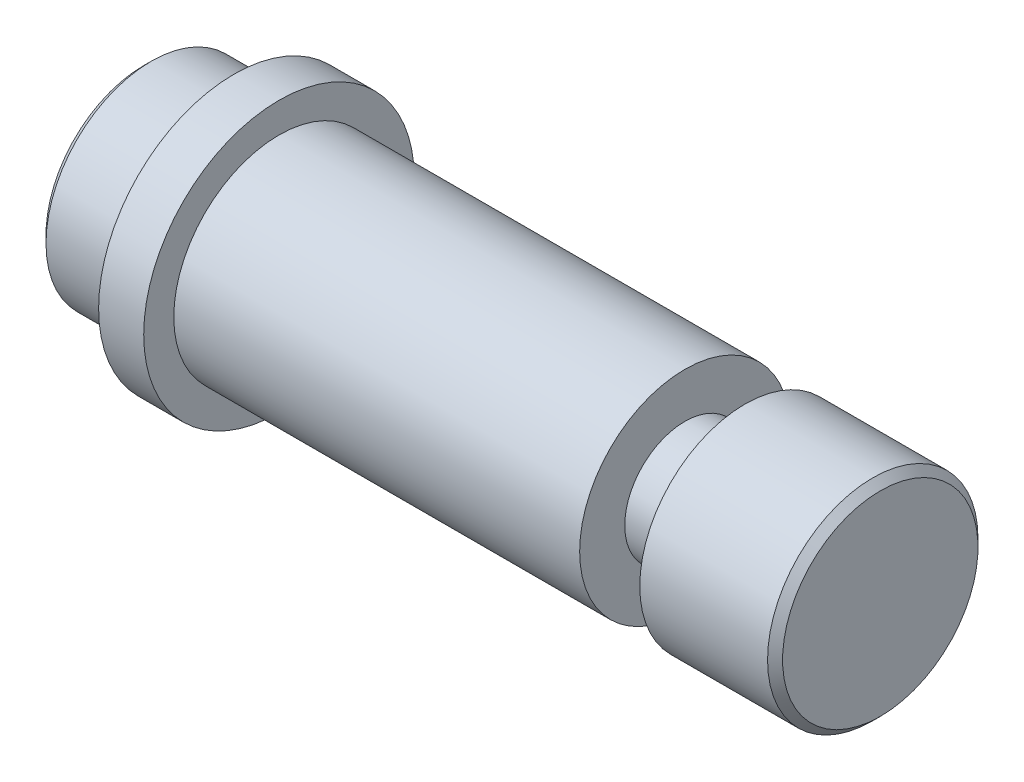
ISO-10303-21;
HEADER;
FILE_DESCRIPTION(('STEP AP214'),'2;1');
FILE_NAME('part.step','',(''),(''),'','','');
FILE_SCHEMA(('AUTOMOTIVE_DESIGN { 1 0 10303 214 1 1 1 1 }'));
ENDSEC;
DATA;
#1=APPLICATION_CONTEXT('core data for automotive mechanical design processes');
#2=APPLICATION_PROTOCOL_DEFINITION('international standard','automotive_design',2000,#1);
#3=PRODUCT_CONTEXT('',#1,'mechanical');
#4=PRODUCT('Part','Part','',(#3));
#5=PRODUCT_RELATED_PRODUCT_CATEGORY('part','',(#4));
#6=PRODUCT_DEFINITION_FORMATION('','',#4);
#7=PRODUCT_DEFINITION_CONTEXT('part definition',#1,'design');
#8=PRODUCT_DEFINITION('design','',#6,#7);
#9=PRODUCT_DEFINITION_SHAPE('','',#8);
#10=(LENGTH_UNIT() NAMED_UNIT(*) SI_UNIT(.MILLI.,.METRE.));
#11=(NAMED_UNIT(*) PLANE_ANGLE_UNIT() SI_UNIT($,.RADIAN.));
#12=(NAMED_UNIT(*) SI_UNIT($,.STERADIAN.) SOLID_ANGLE_UNIT());
#13=UNCERTAINTY_MEASURE_WITH_UNIT(LENGTH_MEASURE(1.E-05),#10,'distance_accuracy_value','');
#14=(GEOMETRIC_REPRESENTATION_CONTEXT(3) GLOBAL_UNCERTAINTY_ASSIGNED_CONTEXT((#13)) GLOBAL_UNIT_ASSIGNED_CONTEXT((#10,
#11,#12)) REPRESENTATION_CONTEXT('',''));
#15=CARTESIAN_POINT('',(0.,0.,0.));
#16=DIRECTION('',(0.,0.,1.));
#17=DIRECTION('',(1.,0.,0.));
#18=AXIS2_PLACEMENT_3D('',#15,#16,#17);
#19=CARTESIAN_POINT('',(-18.3988269794721,0.,0.));
#20=DIRECTION('',(-1.,0.,0.));
#21=DIRECTION('',(0.,-1.,0.));
#22=AXIS2_PLACEMENT_3D('',#19,#20,#21);
#23=PLANE('',#22);
#24=CARTESIAN_POINT('',(-18.3988269794721,0.,0.));
#25=DIRECTION('',(-1.,0.,0.));
#26=DIRECTION('',(0.,-1.,0.));
#27=AXIS2_PLACEMENT_3D('',#24,#25,#26);
#28=CIRCLE('',#27,6.5);
#29=CARTESIAN_POINT('',(-18.3988269794721,-6.5,0.));
#30=VERTEX_POINT('',#29);
#31=EDGE_CURVE('E10',#30,#30,#28,.T.);
#32=ORIENTED_EDGE('',*,*,#31,.T.);
#33=EDGE_LOOP('',(#32));
#34=FACE_BOUND('',#33,.T.);
#35=ADVANCED_FACE('F33',(#34),#23,.T.);
#36=CARTESIAN_POINT('',(30.6011730205279,0.,0.));
#37=DIRECTION('',(1.,0.,0.));
#38=DIRECTION('',(0.,1.,0.));
#39=AXIS2_PLACEMENT_3D('',#36,#37,#38);
#40=CYLINDRICAL_SURFACE('',#39,7.);
#41=CARTESIAN_POINT('',(-17.8988269794721,0.,0.));
#42=DIRECTION('',(-1.,0.,0.));
#43=DIRECTION('',(0.,-1.,0.));
#44=AXIS2_PLACEMENT_3D('',#41,#42,#43);
#45=CIRCLE('',#44,7.);
#46=CARTESIAN_POINT('',(-17.8988269794721,-7.,0.));
#47=VERTEX_POINT('',#46);
#48=EDGE_CURVE('E41',#47,#47,#45,.F.);
#49=ORIENTED_EDGE('',*,*,#48,.T.);
#50=EDGE_LOOP('',(#49));
#51=FACE_BOUND('',#50,.T.);
#52=CARTESIAN_POINT('',(-12.3988269794721,0.,0.));
#53=DIRECTION('',(1.,0.,0.));
#54=DIRECTION('',(0.,1.,0.));
#55=AXIS2_PLACEMENT_3D('',#52,#53,#54);
#56=CIRCLE('',#55,7.);
#57=CARTESIAN_POINT('',(-12.3988269794721,7.,0.));
#58=VERTEX_POINT('',#57);
#59=EDGE_CURVE('E54',#58,#58,#56,.T.);
#60=ORIENTED_EDGE('',*,*,#59,.F.);
#61=EDGE_LOOP('',(#60));
#62=FACE_BOUND('',#61,.T.);
#63=ADVANCED_FACE('F97',(#51,#62),#40,.T.);
#64=CARTESIAN_POINT('',(-12.3988269794721,7.,0.));
#65=DIRECTION('',(-1.,0.,0.));
#66=DIRECTION('',(0.,-1.,0.));
#67=AXIS2_PLACEMENT_3D('',#64,#65,#66);
#68=PLANE('',#67);
#69=ORIENTED_EDGE('',*,*,#59,.T.);
#70=EDGE_LOOP('',(#69));
#71=FACE_BOUND('',#70,.T.);
#72=CARTESIAN_POINT('',(-12.3988269794721,0.,0.));
#73=DIRECTION('',(1.,0.,0.));
#74=DIRECTION('',(0.,1.,0.));
#75=AXIS2_PLACEMENT_3D('',#72,#73,#74);
#76=CIRCLE('',#75,9.);
#77=CARTESIAN_POINT('',(-12.3988269794721,9.,0.));
#78=VERTEX_POINT('',#77);
#79=EDGE_CURVE('E57',#78,#78,#76,.T.);
#80=ORIENTED_EDGE('',*,*,#79,.F.);
#81=EDGE_LOOP('',(#80));
#82=FACE_BOUND('',#81,.T.);
#83=ADVANCED_FACE('F102',(#71,#82),#68,.T.);
#84=CARTESIAN_POINT('',(30.6011730205279,0.,0.));
#85=DIRECTION('',(1.,0.,0.));
#86=DIRECTION('',(0.,1.,0.));
#87=AXIS2_PLACEMENT_3D('',#84,#85,#86);
#88=CYLINDRICAL_SURFACE('',#87,9.);
#89=ORIENTED_EDGE('',*,*,#79,.T.);
#90=EDGE_LOOP('',(#89));
#91=FACE_BOUND('',#90,.T.);
#92=CARTESIAN_POINT('',(-9.39882697947214,0.,0.));
#93=DIRECTION('',(1.,0.,0.));
#94=DIRECTION('',(0.,1.,0.));
#95=AXIS2_PLACEMENT_3D('',#92,#93,#94);
#96=CIRCLE('',#95,9.);
#97=CARTESIAN_POINT('',(-9.39882697947214,9.,0.));
#98=VERTEX_POINT('',#97);
#99=EDGE_CURVE('E60',#98,#98,#96,.T.);
#100=ORIENTED_EDGE('',*,*,#99,.F.);
#101=EDGE_LOOP('',(#100));
#102=FACE_BOUND('',#101,.T.);
#103=ADVANCED_FACE('F178',(#91,#102),#88,.T.);
#104=CARTESIAN_POINT('',(-9.39882697947214,9.,0.));
#105=DIRECTION('',(1.,0.,0.));
#106=DIRECTION('',(0.,1.,0.));
#107=AXIS2_PLACEMENT_3D('',#104,#105,#106);
#108=PLANE('',#107);
#109=ORIENTED_EDGE('',*,*,#99,.T.);
#110=EDGE_LOOP('',(#109));
#111=FACE_BOUND('',#110,.T.);
#112=CARTESIAN_POINT('',(-9.39882697947214,0.,0.));
#113=DIRECTION('',(1.,0.,0.));
#114=DIRECTION('',(0.,1.,0.));
#115=AXIS2_PLACEMENT_3D('',#112,#113,#114);
#116=CIRCLE('',#115,7.);
#117=CARTESIAN_POINT('',(-9.39882697947214,7.,0.));
#118=VERTEX_POINT('',#117);
#119=EDGE_CURVE('E63',#118,#118,#116,.T.);
#120=ORIENTED_EDGE('',*,*,#119,.F.);
#121=EDGE_LOOP('',(#120));
#122=FACE_BOUND('',#121,.T.);
#123=ADVANCED_FACE('F168',(#111,#122),#108,.T.);
#124=CARTESIAN_POINT('',(30.6011730205279,0.,0.));
#125=DIRECTION('',(1.,0.,0.));
#126=DIRECTION('',(0.,1.,0.));
#127=AXIS2_PLACEMENT_3D('',#124,#125,#126);
#128=CYLINDRICAL_SURFACE('',#127,7.);
#129=ORIENTED_EDGE('',*,*,#119,.T.);
#130=EDGE_LOOP('',(#129));
#131=FACE_BOUND('',#130,.T.);
#132=CARTESIAN_POINT('',(17.6011730205279,0.,0.));
#133=DIRECTION('',(1.,0.,0.));
#134=DIRECTION('',(0.,1.,0.));
#135=AXIS2_PLACEMENT_3D('',#132,#133,#134);
#136=CIRCLE('',#135,7.);
#137=CARTESIAN_POINT('',(17.6011730205279,7.,0.));
#138=VERTEX_POINT('',#137);
#139=EDGE_CURVE('E66',#138,#138,#136,.T.);
#140=ORIENTED_EDGE('',*,*,#139,.F.);
#141=EDGE_LOOP('',(#140));
#142=FACE_BOUND('',#141,.T.);
#143=ADVANCED_FACE('F158',(#131,#142),#128,.T.);
#144=CARTESIAN_POINT('',(17.6011730205279,7.,0.));
#145=DIRECTION('',(1.,0.,0.));
#146=DIRECTION('',(0.,1.,0.));
#147=AXIS2_PLACEMENT_3D('',#144,#145,#146);
#148=PLANE('',#147);
#149=ORIENTED_EDGE('',*,*,#139,.T.);
#150=EDGE_LOOP('',(#149));
#151=FACE_BOUND('',#150,.T.);
#152=CARTESIAN_POINT('',(17.6011730205279,0.,0.));
#153=DIRECTION('',(1.,0.,0.));
#154=DIRECTION('',(0.,1.,0.));
#155=AXIS2_PLACEMENT_3D('',#152,#153,#154);
#156=CIRCLE('',#155,4.);
#157=CARTESIAN_POINT('',(17.6011730205279,4.,0.));
#158=VERTEX_POINT('',#157);
#159=EDGE_CURVE('E69',#158,#158,#156,.T.);
#160=ORIENTED_EDGE('',*,*,#159,.F.);
#161=EDGE_LOOP('',(#160));
#162=FACE_BOUND('',#161,.T.);
#163=ADVANCED_FACE('F93',(#151,#162),#148,.T.);
#164=CARTESIAN_POINT('',(30.6011730205279,0.,0.));
#165=DIRECTION('',(1.,0.,0.));
#166=DIRECTION('',(0.,1.,0.));
#167=AXIS2_PLACEMENT_3D('',#164,#165,#166);
#168=CYLINDRICAL_SURFACE('',#167,4.);
#169=ORIENTED_EDGE('',*,*,#159,.T.);
#170=EDGE_LOOP('',(#169));
#171=FACE_BOUND('',#170,.T.);
#172=CARTESIAN_POINT('',(21.6011730205279,0.,0.));
#173=DIRECTION('',(1.,0.,0.));
#174=DIRECTION('',(0.,1.,0.));
#175=AXIS2_PLACEMENT_3D('',#172,#173,#174);
#176=CIRCLE('',#175,4.);
#177=CARTESIAN_POINT('',(21.6011730205279,4.,0.));
#178=VERTEX_POINT('',#177);
#179=EDGE_CURVE('E72',#178,#178,#176,.T.);
#180=ORIENTED_EDGE('',*,*,#179,.F.);
#181=EDGE_LOOP('',(#180));
#182=FACE_BOUND('',#181,.T.);
#183=ADVANCED_FACE('F83',(#171,#182),#168,.T.);
#184=CARTESIAN_POINT('',(21.6011730205279,4.,0.));
#185=DIRECTION('',(-1.,0.,0.));
#186=DIRECTION('',(0.,-1.,0.));
#187=AXIS2_PLACEMENT_3D('',#184,#185,#186);
#188=PLANE('',#187);
#189=ORIENTED_EDGE('',*,*,#179,.T.);
#190=EDGE_LOOP('',(#189));
#191=FACE_BOUND('',#190,.T.);
#192=CARTESIAN_POINT('',(21.6011730205279,0.,0.));
#193=DIRECTION('',(1.,0.,0.));
#194=DIRECTION('',(0.,1.,0.));
#195=AXIS2_PLACEMENT_3D('',#192,#193,#194);
#196=CIRCLE('',#195,6.99999999999999);
#197=CARTESIAN_POINT('',(21.6011730205279,7.,0.));
#198=VERTEX_POINT('',#197);
#199=EDGE_CURVE('E75',#198,#198,#196,.T.);
#200=ORIENTED_EDGE('',*,*,#199,.F.);
#201=EDGE_LOOP('',(#200));
#202=FACE_BOUND('',#201,.T.);
#203=ADVANCED_FACE('F81',(#191,#202),#188,.T.);
#204=CARTESIAN_POINT('',(30.6011730205279,0.,0.));
#205=DIRECTION('',(1.,0.,0.));
#206=DIRECTION('',(0.,1.,0.));
#207=AXIS2_PLACEMENT_3D('',#204,#205,#206);
#208=CYLINDRICAL_SURFACE('',#207,6.99999999999999);
#209=CARTESIAN_POINT('',(30.1011730205279,0.,0.));
#210=DIRECTION('',(1.,0.,0.));
#211=DIRECTION('',(0.,1.,0.));
#212=AXIS2_PLACEMENT_3D('',#209,#210,#211);
#213=CIRCLE('',#212,6.99999999999999);
#214=CARTESIAN_POINT('',(30.1011730205279,7.,0.));
#215=VERTEX_POINT('',#214);
#216=EDGE_CURVE('E45',#215,#215,#213,.F.);
#217=ORIENTED_EDGE('',*,*,#216,.T.);
#218=EDGE_LOOP('',(#217));
#219=FACE_BOUND('',#218,.T.);
#220=ORIENTED_EDGE('',*,*,#199,.T.);
#221=EDGE_LOOP('',(#220));
#222=FACE_BOUND('',#221,.T.);
#223=ADVANCED_FACE('F79',(#219,#222),#208,.T.);
#224=CARTESIAN_POINT('',(30.6011730205279,7.,0.));
#225=DIRECTION('',(1.,0.,0.));
#226=DIRECTION('',(0.,1.,0.));
#227=AXIS2_PLACEMENT_3D('',#224,#225,#226);
#228=PLANE('',#227);
#229=CARTESIAN_POINT('',(30.6011730205279,0.,0.));
#230=DIRECTION('',(1.,0.,0.));
#231=DIRECTION('',(0.,1.,0.));
#232=AXIS2_PLACEMENT_3D('',#229,#230,#231);
#233=CIRCLE('',#232,6.5);
#234=CARTESIAN_POINT('',(30.6011730205279,6.50000000000001,0.));
#235=VERTEX_POINT('',#234);
#236=EDGE_CURVE('E49',#235,#235,#233,.T.);
#237=ORIENTED_EDGE('',*,*,#236,.T.);
#238=EDGE_LOOP('',(#237));
#239=FACE_BOUND('',#238,.T.);
#240=ADVANCED_FACE('F90',(#239),#228,.T.);
#241=CARTESIAN_POINT('',(30.6011730205279,0.,0.));
#242=DIRECTION('',(-1.,0.,0.));
#243=DIRECTION('',(0.,-1.,0.));
#244=AXIS2_PLACEMENT_3D('',#241,#242,#243);
#245=CONICAL_SURFACE('',#244,6.5,0.785398163397445);
#246=ORIENTED_EDGE('',*,*,#216,.F.);
#247=EDGE_LOOP('',(#246));
#248=FACE_BOUND('',#247,.T.);
#249=ORIENTED_EDGE('',*,*,#236,.F.);
#250=EDGE_LOOP('',(#249));
#251=FACE_BOUND('',#250,.T.);
#252=ADVANCED_FACE('F106',(#248,#251),#245,.T.);
#253=CARTESIAN_POINT('',(-17.8988269794721,0.,0.));
#254=DIRECTION('',(1.,0.,0.));
#255=DIRECTION('',(0.,1.,0.));
#256=AXIS2_PLACEMENT_3D('',#253,#254,#255);
#257=CONICAL_SURFACE('',#256,7.,0.785398163397443);
#258=ORIENTED_EDGE('',*,*,#31,.F.);
#259=EDGE_LOOP('',(#258));
#260=FACE_BOUND('',#259,.T.);
#261=ORIENTED_EDGE('',*,*,#48,.F.);
#262=EDGE_LOOP('',(#261));
#263=FACE_BOUND('',#262,.T.);
#264=ADVANCED_FACE('F36',(#260,#263),#257,.T.);
#265=CLOSED_SHELL('',(#35,#63,#83,#103,#123,#143,#163,#183,#203,#223,#240,#252,#264));
#266=MANIFOLD_SOLID_BREP('B2',#265);
#267=ADVANCED_BREP_SHAPE_REPRESENTATION('',(#18,#266),#14);
#268=SHAPE_DEFINITION_REPRESENTATION(#9,#267);
ENDSEC;
END-ISO-10303-21;
